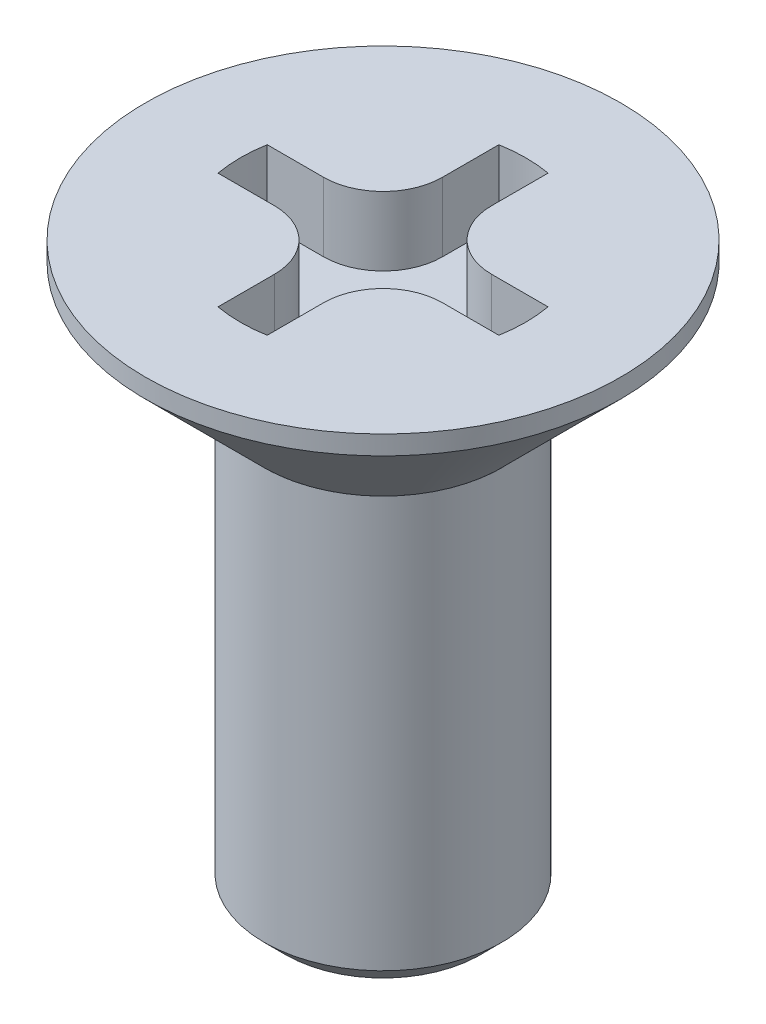
ISO-10303-21;
HEADER;
FILE_DESCRIPTION(('STEP AP214'),'2;1');
FILE_NAME('part.step','',(''),(''),'','','');
FILE_SCHEMA(('AUTOMOTIVE_DESIGN { 1 0 10303 214 1 1 1 1 }'));
ENDSEC;
DATA;
#1=APPLICATION_CONTEXT('core data for automotive mechanical design processes');
#2=APPLICATION_PROTOCOL_DEFINITION('international standard','automotive_design',2000,#1);
#3=PRODUCT_CONTEXT('',#1,'mechanical');
#4=PRODUCT('Part','Part','',(#3));
#5=PRODUCT_RELATED_PRODUCT_CATEGORY('part','',(#4));
#6=PRODUCT_DEFINITION_FORMATION('','',#4);
#7=PRODUCT_DEFINITION_CONTEXT('part definition',#1,'design');
#8=PRODUCT_DEFINITION('design','',#6,#7);
#9=PRODUCT_DEFINITION_SHAPE('','',#8);
#10=(LENGTH_UNIT() NAMED_UNIT(*) SI_UNIT(.MILLI.,.METRE.));
#11=(NAMED_UNIT(*) PLANE_ANGLE_UNIT() SI_UNIT($,.RADIAN.));
#12=(NAMED_UNIT(*) SI_UNIT($,.STERADIAN.) SOLID_ANGLE_UNIT());
#13=UNCERTAINTY_MEASURE_WITH_UNIT(LENGTH_MEASURE(1.E-05),#10,'distance_accuracy_value','');
#14=(GEOMETRIC_REPRESENTATION_CONTEXT(3) GLOBAL_UNCERTAINTY_ASSIGNED_CONTEXT((#13)) GLOBAL_UNIT_ASSIGNED_CONTEXT((#10,
#11,#12)) REPRESENTATION_CONTEXT('',''));
#15=CARTESIAN_POINT('',(0.,0.,0.));
#16=DIRECTION('',(0.,0.,1.));
#17=DIRECTION('',(1.,0.,0.));
#18=AXIS2_PLACEMENT_3D('',#15,#16,#17);
#19=CARTESIAN_POINT('',(0.,-4.55,0.));
#20=DIRECTION('',(0.,1.,0.));
#21=DIRECTION('',(0.,0.,1.));
#22=AXIS2_PLACEMENT_3D('',#19,#20,#21);
#23=CYLINDRICAL_SURFACE('',#22,1.025);
#24=CARTESIAN_POINT('',(0.,0.,0.));
#25=DIRECTION('',(0.,1.,0.));
#26=DIRECTION('',(0.,0.,1.));
#27=AXIS2_PLACEMENT_3D('',#24,#25,#26);
#28=CIRCLE('',#27,1.025);
#29=CARTESIAN_POINT('',(0.,0.,1.025));
#30=VERTEX_POINT('',#29);
#31=EDGE_CURVE('P0_E20',#30,#30,#28,.F.);
#32=ORIENTED_EDGE('',*,*,#31,.T.);
#33=EDGE_LOOP('',(#32));
#34=FACE_BOUND('',#33,.T.);
#35=CARTESIAN_POINT('',(0.,-4.55,0.));
#36=DIRECTION('',(0.,1.,0.));
#37=DIRECTION('',(0.,0.,1.));
#38=AXIS2_PLACEMENT_3D('',#35,#36,#37);
#39=CIRCLE('',#38,1.025);
#40=CARTESIAN_POINT('',(0.,-4.55,1.025));
#41=VERTEX_POINT('',#40);
#42=EDGE_CURVE('P0_E11',#41,#41,#39,.T.);
#43=ORIENTED_EDGE('',*,*,#42,.T.);
#44=EDGE_LOOP('',(#43));
#45=FACE_BOUND('',#44,.T.);
#46=ADVANCED_FACE('P0_F16',(#34,#45),#23,.T.);
#47=CARTESIAN_POINT('',(0.,0.,0.));
#48=DIRECTION('',(0.,1.,0.));
#49=DIRECTION('',(0.,0.,1.));
#50=AXIS2_PLACEMENT_3D('',#47,#48,#49);
#51=PLANE('',#50);
#52=ORIENTED_EDGE('',*,*,#31,.F.);
#53=EDGE_LOOP('',(#52));
#54=FACE_BOUND('',#53,.T.);
#55=CARTESIAN_POINT('',(-1.25,0.,0.));
#56=CARTESIAN_POINT('',(-1.25,0.,0.238161647635405));
#57=CARTESIAN_POINT('',(-1.16223537632804,0.,0.460118386952341));
#58=CARTESIAN_POINT('',(-1.0672352810342,0.,0.70037363449981));
#59=CARTESIAN_POINT('',(-0.883883476483185,0.,0.883883476483184));
#60=CARTESIAN_POINT('',(-0.701276541147978,0.,1.06664780722151));
#61=CARTESIAN_POINT('',(-0.460118386952341,0.,1.16223537632804));
#62=CARTESIAN_POINT('',(-0.238952578700221,0.,1.24989860318766));
#63=CARTESIAN_POINT('',(0.,0.,1.25));
#64=CARTESIAN_POINT('',(0.237906337866149,0.,1.25010095285193));
#65=CARTESIAN_POINT('',(0.460118386952341,0.,1.16223537632804));
#66=CARTESIAN_POINT('',(0.700373634500057,0.,1.06723528103401));
#67=CARTESIAN_POINT('',(0.883883476483184,0.,0.883883476483184));
#68=CARTESIAN_POINT('',(1.06664780722158,0.,0.701276541147861));
#69=CARTESIAN_POINT('',(1.16223537632804,0.,0.460118386952341));
#70=CARTESIAN_POINT('',(1.25,0.,0.23869676438945));
#71=CARTESIAN_POINT('',(1.25,0.,0.));
#72=B_SPLINE_CURVE_WITH_KNOTS('',2,(#55,#56,#57,#58,#59,#60,#61,#62,#63,#64,#65,#66,#67,#68,#69,
#70,#71),.UNSPECIFIED.,.F.,.F.,(3,2,2,2,2,2,2,2,3),(0.,0.125,0.25,0.375,0.5,0.625,0.75,0.875,
1.),.UNSPECIFIED.);
#73=CARTESIAN_POINT('',(-1.25,0.,0.));
#74=VERTEX_POINT('',#73);
#75=CARTESIAN_POINT('',(1.25,0.,0.));
#76=VERTEX_POINT('',#75);
#77=EDGE_CURVE('P0_E28',#74,#76,#72,.T.);
#78=ORIENTED_EDGE('',*,*,#77,.F.);
#79=CARTESIAN_POINT('',(1.25,0.,0.));
#80=CARTESIAN_POINT('',(1.25,0.,-0.238161647635405));
#81=CARTESIAN_POINT('',(1.16223537632804,0.,-0.460118386952341));
#82=CARTESIAN_POINT('',(1.0672352810342,0.,-0.70037363449981));
#83=CARTESIAN_POINT('',(0.883883476483185,0.,-0.883883476483184));
#84=CARTESIAN_POINT('',(0.701276541147978,0.,-1.06664780722151));
#85=CARTESIAN_POINT('',(0.460118386952341,0.,-1.16223537632804));
#86=CARTESIAN_POINT('',(0.238952578700221,0.,-1.24989860318766));
#87=CARTESIAN_POINT('',(0.,0.,-1.25));
#88=CARTESIAN_POINT('',(-0.237906337866149,0.,-1.25010095285193));
#89=CARTESIAN_POINT('',(-0.460118386952341,0.,-1.16223537632804));
#90=CARTESIAN_POINT('',(-0.700373634500057,0.,-1.06723528103401));
#91=CARTESIAN_POINT('',(-0.883883476483184,0.,-0.883883476483184));
#92=CARTESIAN_POINT('',(-1.06664780722158,0.,-0.701276541147861));
#93=CARTESIAN_POINT('',(-1.16223537632804,0.,-0.460118386952341));
#94=CARTESIAN_POINT('',(-1.25,0.,-0.23869676438945));
#95=CARTESIAN_POINT('',(-1.25,0.,0.));
#96=B_SPLINE_CURVE_WITH_KNOTS('',2,(#79,#80,#81,#82,#83,#84,#85,#86,#87,#88,#89,#90,#91,#92,#93,
#94,#95),.UNSPECIFIED.,.F.,.F.,(3,2,2,2,2,2,2,2,3),(0.,0.125,0.25,0.375,0.5,0.625,0.75,0.875,
1.),.UNSPECIFIED.);
#97=EDGE_CURVE('P0_E32',#76,#74,#96,.T.);
#98=ORIENTED_EDGE('',*,*,#97,.F.);
#99=EDGE_LOOP('',(#78,#98));
#100=FACE_BOUND('',#99,.T.);
#101=ADVANCED_FACE('P0_F17',(#54,#100),#51,.F.);
#102=OPEN_SHELL('',(#46,#101));
#103=SHELL_BASED_SURFACE_MODEL('P0_B1',(#102));
#104=CARTESIAN_POINT('',(0.,0.725,0.));
#105=DIRECTION('',(0.,-1.,0.));
#106=DIRECTION('',(0.,0.,-1.));
#107=AXIS2_PLACEMENT_3D('',#104,#105,#106);
#108=PLANE('',#107);
#109=DIRECTION('',(0.,0.,1.));
#110=VECTOR('',#109,1.);
#111=CARTESIAN_POINT('',(-0.2588834764832,0.725,1.477490895269));
#112=LINE('',#111,#110);
#113=CARTESIAN_POINT('',(-0.2588834764832,0.725,0.8838834764832));
#114=VERTEX_POINT('',#113);
#115=CARTESIAN_POINT('',(-0.258883476483234,0.725,1.47749089526939));
#116=VERTEX_POINT('',#115);
#117=EDGE_CURVE('P1_E151',#114,#116,#112,.T.);
#118=ORIENTED_EDGE('',*,*,#117,.T.);
#119=CARTESIAN_POINT('',(0.,0.725,0.));
#120=DIRECTION('',(0.,-1.,0.));
#121=DIRECTION('',(0.,0.,-1.));
#122=AXIS2_PLACEMENT_3D('',#119,#120,#121);
#123=CIRCLE('',#122,1.5);
#124=CARTESIAN_POINT('',(0.2588834764832,0.725,1.4774908952692));
#125=VERTEX_POINT('',#124);
#126=EDGE_CURVE('P1_E159',#116,#125,#123,.F.);
#127=ORIENTED_EDGE('',*,*,#126,.T.);
#128=DIRECTION('',(0.,0.,-1.));
#129=VECTOR('',#128,1.);
#130=CARTESIAN_POINT('',(0.2588834764832,0.725,0.8838834764832));
#131=LINE('',#130,#129);
#132=CARTESIAN_POINT('',(0.2588834764832,0.725,0.8838834764832));
#133=VERTEX_POINT('',#132);
#134=EDGE_CURVE('P1_E163',#125,#133,#131,.T.);
#135=ORIENTED_EDGE('',*,*,#134,.T.);
#136=CARTESIAN_POINT('',(0.8838834764832,0.725,0.8838834764832));
#137=DIRECTION('',(0.,-1.,0.));
#138=DIRECTION('',(0.,0.,-1.));
#139=AXIS2_PLACEMENT_3D('',#136,#137,#138);
#140=CIRCLE('',#139,0.625);
#141=CARTESIAN_POINT('',(0.8838834764832,0.725,0.2588834764832));
#142=VERTEX_POINT('',#141);
#143=EDGE_CURVE('P1_E215',#142,#133,#140,.F.);
#144=ORIENTED_EDGE('',*,*,#143,.F.);
#145=DIRECTION('',(1.,0.,0.));
#146=VECTOR('',#145,1.);
#147=CARTESIAN_POINT('',(1.477490895269,0.725,0.2588834764832));
#148=LINE('',#147,#146);
#149=CARTESIAN_POINT('',(1.47749089526939,0.725,0.258883476483234));
#150=VERTEX_POINT('',#149);
#151=EDGE_CURVE('P1_E234',#142,#150,#148,.T.);
#152=ORIENTED_EDGE('',*,*,#151,.T.);
#153=CARTESIAN_POINT('',(0.,0.725,0.));
#154=DIRECTION('',(0.,-1.,0.));
#155=DIRECTION('',(0.,0.,-1.));
#156=AXIS2_PLACEMENT_3D('',#153,#154,#155);
#157=CIRCLE('',#156,1.5);
#158=CARTESIAN_POINT('',(1.4774908952692,0.725,-0.2588834764832));
#159=VERTEX_POINT('',#158);
#160=EDGE_CURVE('P1_E211',#150,#159,#157,.F.);
#161=ORIENTED_EDGE('',*,*,#160,.T.);
#162=DIRECTION('',(-1.,0.,0.));
#163=VECTOR('',#162,1.);
#164=CARTESIAN_POINT('',(0.8838834764832,0.725,-0.2588834764832));
#165=LINE('',#164,#163);
#166=CARTESIAN_POINT('',(0.8838834764832,0.725,-0.2588834764832));
#167=VERTEX_POINT('',#166);
#168=EDGE_CURVE('P1_E210',#159,#167,#165,.T.);
#169=ORIENTED_EDGE('',*,*,#168,.T.);
#170=CARTESIAN_POINT('',(0.8838834764832,0.725,-0.8838834764832));
#171=DIRECTION('',(0.,-1.,0.));
#172=DIRECTION('',(0.,0.,-1.));
#173=AXIS2_PLACEMENT_3D('',#170,#171,#172);
#174=CIRCLE('',#173,0.625);
#175=CARTESIAN_POINT('',(0.2588834764832,0.725,-0.8838834764832));
#176=VERTEX_POINT('',#175);
#177=EDGE_CURVE('P1_E206',#176,#167,#174,.F.);
#178=ORIENTED_EDGE('',*,*,#177,.F.);
#179=DIRECTION('',(0.,0.,-1.));
#180=VECTOR('',#179,1.);
#181=CARTESIAN_POINT('',(0.2588834764832,0.725,-1.477490895269));
#182=LINE('',#181,#180);
#183=CARTESIAN_POINT('',(0.258883476483234,0.725,-1.47749089526939));
#184=VERTEX_POINT('',#183);
#185=EDGE_CURVE('P1_E231',#176,#184,#182,.T.);
#186=ORIENTED_EDGE('',*,*,#185,.T.);
#187=CARTESIAN_POINT('',(0.,0.725,0.));
#188=DIRECTION('',(0.,-1.,0.));
#189=DIRECTION('',(0.,0.,-1.));
#190=AXIS2_PLACEMENT_3D('',#187,#188,#189);
#191=CIRCLE('',#190,1.5);
#192=CARTESIAN_POINT('',(-0.2588834764832,0.725,-1.4774908952692));
#193=VERTEX_POINT('',#192);
#194=EDGE_CURVE('P1_E202',#184,#193,#191,.F.);
#195=ORIENTED_EDGE('',*,*,#194,.T.);
#196=DIRECTION('',(0.,0.,1.));
#197=VECTOR('',#196,1.);
#198=CARTESIAN_POINT('',(-0.2588834764832,0.725,-0.8838834764832));
#199=LINE('',#198,#197);
#200=CARTESIAN_POINT('',(-0.2588834764832,0.725,-0.8838834764832));
#201=VERTEX_POINT('',#200);
#202=EDGE_CURVE('P1_E201',#193,#201,#199,.T.);
#203=ORIENTED_EDGE('',*,*,#202,.T.);
#204=CARTESIAN_POINT('',(-0.8838834764832,0.725,-0.8838834764832));
#205=DIRECTION('',(0.,-1.,0.));
#206=DIRECTION('',(0.,0.,-1.));
#207=AXIS2_PLACEMENT_3D('',#204,#205,#206);
#208=CIRCLE('',#207,0.625);
#209=CARTESIAN_POINT('',(-0.8838834764832,0.725,-0.2588834764832));
#210=VERTEX_POINT('',#209);
#211=EDGE_CURVE('P1_E197',#210,#201,#208,.F.);
#212=ORIENTED_EDGE('',*,*,#211,.F.);
#213=DIRECTION('',(-1.,0.,0.));
#214=VECTOR('',#213,1.);
#215=CARTESIAN_POINT('',(-1.477490895269,0.725,-0.2588834764832));
#216=LINE('',#215,#214);
#217=CARTESIAN_POINT('',(-1.47749089526939,0.725,-0.258883476483234));
#218=VERTEX_POINT('',#217);
#219=EDGE_CURVE('P1_E227',#210,#218,#216,.T.);
#220=ORIENTED_EDGE('',*,*,#219,.T.);
#221=CARTESIAN_POINT('',(0.,0.725,0.));
#222=DIRECTION('',(0.,-1.,0.));
#223=DIRECTION('',(0.,0.,-1.));
#224=AXIS2_PLACEMENT_3D('',#221,#222,#223);
#225=CIRCLE('',#224,1.5);
#226=CARTESIAN_POINT('',(-1.47749089526939,0.725,0.258883476483234));
#227=VERTEX_POINT('',#226);
#228=EDGE_CURVE('P1_E132',#218,#227,#225,.F.);
#229=ORIENTED_EDGE('',*,*,#228,.T.);
#230=DIRECTION('',(1.,0.,0.));
#231=VECTOR('',#230,1.);
#232=CARTESIAN_POINT('',(-0.8838834764832,0.725,0.2588834764832));
#233=LINE('',#232,#231);
#234=CARTESIAN_POINT('',(-0.8838834764832,0.725,0.2588834764832));
#235=VERTEX_POINT('',#234);
#236=EDGE_CURVE('P1_E129',#227,#235,#233,.T.);
#237=ORIENTED_EDGE('',*,*,#236,.T.);
#238=CARTESIAN_POINT('',(-0.8838834764832,0.725,0.8838834764832));
#239=DIRECTION('',(0.,-1.,0.));
#240=DIRECTION('',(0.,0.,-1.));
#241=AXIS2_PLACEMENT_3D('',#238,#239,#240);
#242=CIRCLE('',#241,0.625);
#243=EDGE_CURVE('P1_E19',#114,#235,#242,.F.);
#244=ORIENTED_EDGE('',*,*,#243,.F.);
#245=EDGE_LOOP('',(#118,#127,#135,#144,#152,#161,#169,#178,#186,#195,#203,#212,#220,#229,#237,#244));
#246=FACE_BOUND('',#245,.T.);
#247=ADVANCED_FACE('P1_F16',(#246),#108,.F.);
#248=CARTESIAN_POINT('',(-0.8838834764832,0.725,0.2588834764832));
#249=DIRECTION('',(0.,0.,1.));
#250=DIRECTION('',(1.,0.,0.));
#251=AXIS2_PLACEMENT_3D('',#248,#249,#250);
#252=PLANE('',#251);
#253=ORIENTED_EDGE('',*,*,#236,.F.);
#254=DIRECTION('',(0.,-1.,0.));
#255=VECTOR('',#254,1.);
#256=CARTESIAN_POINT('',(-1.47749089526939,0.725,0.258883476483268));
#257=LINE('',#256,#255);
#258=CARTESIAN_POINT('',(-1.47749089526939,1.45,0.258883476483234));
#259=VERTEX_POINT('',#258);
#260=EDGE_CURVE('P1_E195',#227,#259,#257,.F.);
#261=ORIENTED_EDGE('',*,*,#260,.T.);
#262=DIRECTION('',(1.,0.,0.));
#263=VECTOR('',#262,1.);
#264=CARTESIAN_POINT('',(0.,1.45,0.2588834764832));
#265=LINE('',#264,#263);
#266=CARTESIAN_POINT('',(-0.8838834764832,1.45,0.2588834764832));
#267=VERTEX_POINT('',#266);
#268=EDGE_CURVE('P1_E140',#259,#267,#265,.T.);
#269=ORIENTED_EDGE('',*,*,#268,.T.);
#270=DIRECTION('',(0.,-1.,0.));
#271=VECTOR('',#270,1.);
#272=CARTESIAN_POINT('',(-0.8838834764832,0.725,0.2588834764832));
#273=LINE('',#272,#271);
#274=EDGE_CURVE('P1_E137',#235,#267,#273,.F.);
#275=ORIENTED_EDGE('',*,*,#274,.F.);
#276=EDGE_LOOP('',(#253,#261,#269,#275));
#277=FACE_BOUND('',#276,.T.);
#278=ADVANCED_FACE('P1_F138',(#277),#252,.F.);
#279=CARTESIAN_POINT('',(-0.8838834764832,0.725,0.8838834764832));
#280=DIRECTION('',(0.,-1.,0.));
#281=DIRECTION('',(0.,0.,-1.));
#282=AXIS2_PLACEMENT_3D('',#279,#280,#281);
#283=CYLINDRICAL_SURFACE('',#282,0.625);
#284=ORIENTED_EDGE('',*,*,#274,.T.);
#285=CARTESIAN_POINT('',(-0.8838834764832,1.45,0.8838834764832));
#286=DIRECTION('',(0.,-1.,0.));
#287=DIRECTION('',(0.,0.,-1.));
#288=AXIS2_PLACEMENT_3D('',#285,#286,#287);
#289=CIRCLE('',#288,0.625);
#290=CARTESIAN_POINT('',(-0.2588834764832,1.45,0.8838834764832));
#291=VERTEX_POINT('',#290);
#292=EDGE_CURVE('P1_E148',#267,#291,#289,.T.);
#293=ORIENTED_EDGE('',*,*,#292,.T.);
#294=DIRECTION('',(0.,1.,0.));
#295=VECTOR('',#294,1.);
#296=CARTESIAN_POINT('',(-0.2588834764832,0.725,0.8838834764832));
#297=LINE('',#296,#295);
#298=EDGE_CURVE('P1_E143',#291,#114,#297,.F.);
#299=ORIENTED_EDGE('',*,*,#298,.T.);
#300=ORIENTED_EDGE('',*,*,#243,.T.);
#301=EDGE_LOOP('',(#284,#293,#299,#300));
#302=FACE_BOUND('',#301,.T.);
#303=ADVANCED_FACE('P1_F145',(#302),#283,.T.);
#304=CARTESIAN_POINT('',(-0.2588834764832,0.725,1.477490895269));
#305=DIRECTION('',(-1.,0.,0.));
#306=DIRECTION('',(0.,0.,1.));
#307=AXIS2_PLACEMENT_3D('',#304,#305,#306);
#308=PLANE('',#307);
#309=ORIENTED_EDGE('',*,*,#117,.F.);
#310=ORIENTED_EDGE('',*,*,#298,.F.);
#311=DIRECTION('',(0.,0.,-1.));
#312=VECTOR('',#311,1.);
#313=CARTESIAN_POINT('',(-0.2588834764832,1.45,0.));
#314=LINE('',#313,#312);
#315=CARTESIAN_POINT('',(-0.258883476483234,1.45,1.47749089526939));
#316=VERTEX_POINT('',#315);
#317=EDGE_CURVE('P1_E192',#291,#316,#314,.F.);
#318=ORIENTED_EDGE('',*,*,#317,.T.);
#319=DIRECTION('',(0.,-1.,0.));
#320=VECTOR('',#319,1.);
#321=CARTESIAN_POINT('',(-0.258883476483268,0.725,1.47749089526939));
#322=LINE('',#321,#320);
#323=EDGE_CURVE('P1_E156',#316,#116,#322,.T.);
#324=ORIENTED_EDGE('',*,*,#323,.T.);
#325=EDGE_LOOP('',(#309,#310,#318,#324));
#326=FACE_BOUND('',#325,.T.);
#327=ADVANCED_FACE('P1_F154',(#326),#308,.F.);
#328=CARTESIAN_POINT('',(0.,0.725,0.));
#329=DIRECTION('',(0.,-1.,0.));
#330=DIRECTION('',(0.,0.,-1.));
#331=AXIS2_PLACEMENT_3D('',#328,#329,#330);
#332=CYLINDRICAL_SURFACE('',#331,1.5);
#333=ORIENTED_EDGE('',*,*,#126,.F.);
#334=ORIENTED_EDGE('',*,*,#323,.F.);
#335=CARTESIAN_POINT('',(0.,1.45,0.));
#336=DIRECTION('',(0.,-1.,0.));
#337=DIRECTION('',(0.,0.,-1.));
#338=AXIS2_PLACEMENT_3D('',#335,#336,#337);
#339=CIRCLE('',#338,1.5);
#340=CARTESIAN_POINT('',(0.2588834764832,1.45,1.4774908952692));
#341=VERTEX_POINT('',#340);
#342=EDGE_CURVE('P1_E190',#316,#341,#339,.F.);
#343=ORIENTED_EDGE('',*,*,#342,.T.);
#344=DIRECTION('',(0.,1.,0.));
#345=VECTOR('',#344,1.);
#346=CARTESIAN_POINT('',(0.2588834764832,0.725,1.477490895269));
#347=LINE('',#346,#345);
#348=EDGE_CURVE('P1_E218',#341,#125,#347,.F.);
#349=ORIENTED_EDGE('',*,*,#348,.T.);
#350=EDGE_LOOP('',(#333,#334,#343,#349));
#351=FACE_BOUND('',#350,.T.);
#352=ADVANCED_FACE('P1_F452',(#351),#332,.F.);
#353=CARTESIAN_POINT('',(0.2588834764832,0.725,0.8838834764832));
#354=DIRECTION('',(1.,0.,0.));
#355=DIRECTION('',(0.,0.,-1.));
#356=AXIS2_PLACEMENT_3D('',#353,#354,#355);
#357=PLANE('',#356);
#358=ORIENTED_EDGE('',*,*,#134,.F.);
#359=ORIENTED_EDGE('',*,*,#348,.F.);
#360=DIRECTION('',(0.,0.,-1.));
#361=VECTOR('',#360,1.);
#362=CARTESIAN_POINT('',(0.2588834764832,1.45,0.));
#363=LINE('',#362,#361);
#364=CARTESIAN_POINT('',(0.2588834764832,1.45,0.8838834764832));
#365=VERTEX_POINT('',#364);
#366=EDGE_CURVE('P1_E189',#341,#365,#363,.T.);
#367=ORIENTED_EDGE('',*,*,#366,.T.);
#368=DIRECTION('',(0.,-1.,0.));
#369=VECTOR('',#368,1.);
#370=CARTESIAN_POINT('',(0.2588834764832,0.725,0.8838834764832));
#371=LINE('',#370,#369);
#372=EDGE_CURVE('P1_E217',#133,#365,#371,.F.);
#373=ORIENTED_EDGE('',*,*,#372,.F.);
#374=EDGE_LOOP('',(#358,#359,#367,#373));
#375=FACE_BOUND('',#374,.T.);
#376=ADVANCED_FACE('P1_F444',(#375),#357,.F.);
#377=CARTESIAN_POINT('',(0.8838834764832,0.725,0.8838834764832));
#378=DIRECTION('',(0.,-1.,0.));
#379=DIRECTION('',(0.,0.,-1.));
#380=AXIS2_PLACEMENT_3D('',#377,#378,#379);
#381=CYLINDRICAL_SURFACE('',#380,0.625);
#382=ORIENTED_EDGE('',*,*,#372,.T.);
#383=CARTESIAN_POINT('',(0.8838834764832,1.45,0.8838834764832));
#384=DIRECTION('',(0.,-1.,0.));
#385=DIRECTION('',(0.,0.,-1.));
#386=AXIS2_PLACEMENT_3D('',#383,#384,#385);
#387=CIRCLE('',#386,0.625);
#388=CARTESIAN_POINT('',(0.8838834764832,1.45,0.2588834764832));
#389=VERTEX_POINT('',#388);
#390=EDGE_CURVE('P1_E187',#365,#389,#387,.T.);
#391=ORIENTED_EDGE('',*,*,#390,.T.);
#392=DIRECTION('',(0.,1.,0.));
#393=VECTOR('',#392,1.);
#394=CARTESIAN_POINT('',(0.8838834764832,0.725,0.2588834764832));
#395=LINE('',#394,#393);
#396=EDGE_CURVE('P1_E235',#389,#142,#395,.F.);
#397=ORIENTED_EDGE('',*,*,#396,.T.);
#398=ORIENTED_EDGE('',*,*,#143,.T.);
#399=EDGE_LOOP('',(#382,#391,#397,#398));
#400=FACE_BOUND('',#399,.T.);
#401=ADVANCED_FACE('P1_F435',(#400),#381,.T.);
#402=CARTESIAN_POINT('',(1.477490895269,0.725,0.2588834764832));
#403=DIRECTION('',(0.,0.,1.));
#404=DIRECTION('',(1.,0.,0.));
#405=AXIS2_PLACEMENT_3D('',#402,#403,#404);
#406=PLANE('',#405);
#407=ORIENTED_EDGE('',*,*,#151,.F.);
#408=ORIENTED_EDGE('',*,*,#396,.F.);
#409=DIRECTION('',(1.,0.,0.));
#410=VECTOR('',#409,1.);
#411=CARTESIAN_POINT('',(0.,1.45,0.2588834764832));
#412=LINE('',#411,#410);
#413=CARTESIAN_POINT('',(1.47749089526939,1.45,0.258883476483234));
#414=VERTEX_POINT('',#413);
#415=EDGE_CURVE('P1_E186',#389,#414,#412,.T.);
#416=ORIENTED_EDGE('',*,*,#415,.T.);
#417=DIRECTION('',(0.,-1.,0.));
#418=VECTOR('',#417,1.);
#419=CARTESIAN_POINT('',(1.47749089526939,0.725,0.258883476483268));
#420=LINE('',#419,#418);
#421=EDGE_CURVE('P1_E214',#414,#150,#420,.T.);
#422=ORIENTED_EDGE('',*,*,#421,.T.);
#423=EDGE_LOOP('',(#407,#408,#416,#422));
#424=FACE_BOUND('',#423,.T.);
#425=ADVANCED_FACE('P1_F426',(#424),#406,.F.);
#426=CARTESIAN_POINT('',(0.,0.725,0.));
#427=DIRECTION('',(0.,-1.,0.));
#428=DIRECTION('',(0.,0.,-1.));
#429=AXIS2_PLACEMENT_3D('',#426,#427,#428);
#430=CYLINDRICAL_SURFACE('',#429,1.5);
#431=ORIENTED_EDGE('',*,*,#160,.F.);
#432=ORIENTED_EDGE('',*,*,#421,.F.);
#433=CARTESIAN_POINT('',(0.,1.45,0.));
#434=DIRECTION('',(0.,-1.,0.));
#435=DIRECTION('',(0.,0.,-1.));
#436=AXIS2_PLACEMENT_3D('',#433,#434,#435);
#437=CIRCLE('',#436,1.5);
#438=CARTESIAN_POINT('',(1.4774908952692,1.45,-0.2588834764832));
#439=VERTEX_POINT('',#438);
#440=EDGE_CURVE('P1_E184',#414,#439,#437,.F.);
#441=ORIENTED_EDGE('',*,*,#440,.T.);
#442=DIRECTION('',(0.,1.,0.));
#443=VECTOR('',#442,1.);
#444=CARTESIAN_POINT('',(1.477490895269,0.725,-0.2588834764832));
#445=LINE('',#444,#443);
#446=EDGE_CURVE('P1_E213',#439,#159,#445,.F.);
#447=ORIENTED_EDGE('',*,*,#446,.T.);
#448=EDGE_LOOP('',(#431,#432,#441,#447));
#449=FACE_BOUND('',#448,.T.);
#450=ADVANCED_FACE('P1_F417',(#449),#430,.F.);
#451=CARTESIAN_POINT('',(0.8838834764832,0.725,-0.2588834764832));
#452=DIRECTION('',(0.,0.,-1.));
#453=DIRECTION('',(-1.,0.,0.));
#454=AXIS2_PLACEMENT_3D('',#451,#452,#453);
#455=PLANE('',#454);
#456=ORIENTED_EDGE('',*,*,#446,.F.);
#457=DIRECTION('',(1.,0.,0.));
#458=VECTOR('',#457,1.);
#459=CARTESIAN_POINT('',(0.,1.45,-0.2588834764832));
#460=LINE('',#459,#458);
#461=CARTESIAN_POINT('',(0.8838834764832,1.45,-0.2588834764832));
#462=VERTEX_POINT('',#461);
#463=EDGE_CURVE('P1_E183',#439,#462,#460,.F.);
#464=ORIENTED_EDGE('',*,*,#463,.T.);
#465=DIRECTION('',(0.,-1.,0.));
#466=VECTOR('',#465,1.);
#467=CARTESIAN_POINT('',(0.8838834764832,0.725,-0.2588834764832));
#468=LINE('',#467,#466);
#469=EDGE_CURVE('P1_E209',#167,#462,#468,.F.);
#470=ORIENTED_EDGE('',*,*,#469,.F.);
#471=ORIENTED_EDGE('',*,*,#168,.F.);
#472=EDGE_LOOP('',(#456,#464,#470,#471));
#473=FACE_BOUND('',#472,.T.);
#474=ADVANCED_FACE('P1_F408',(#473),#455,.F.);
#475=CARTESIAN_POINT('',(0.8838834764832,0.725,-0.8838834764832));
#476=DIRECTION('',(0.,-1.,0.));
#477=DIRECTION('',(0.,0.,-1.));
#478=AXIS2_PLACEMENT_3D('',#475,#476,#477);
#479=CYLINDRICAL_SURFACE('',#478,0.625);
#480=CARTESIAN_POINT('',(0.8838834764832,1.45,-0.8838834764832));
#481=DIRECTION('',(0.,-1.,0.));
#482=DIRECTION('',(0.,0.,-1.));
#483=AXIS2_PLACEMENT_3D('',#480,#481,#482);
#484=CIRCLE('',#483,0.625);
#485=CARTESIAN_POINT('',(0.2588834764832,1.45,-0.8838834764832));
#486=VERTEX_POINT('',#485);
#487=EDGE_CURVE('P1_E181',#462,#486,#484,.T.);
#488=ORIENTED_EDGE('',*,*,#487,.T.);
#489=DIRECTION('',(0.,1.,0.));
#490=VECTOR('',#489,1.);
#491=CARTESIAN_POINT('',(0.2588834764832,0.725,-0.8838834764832));
#492=LINE('',#491,#490);
#493=EDGE_CURVE('P1_E233',#486,#176,#492,.F.);
#494=ORIENTED_EDGE('',*,*,#493,.T.);
#495=ORIENTED_EDGE('',*,*,#177,.T.);
#496=ORIENTED_EDGE('',*,*,#469,.T.);
#497=EDGE_LOOP('',(#488,#494,#495,#496));
#498=FACE_BOUND('',#497,.T.);
#499=ADVANCED_FACE('P1_F399',(#498),#479,.T.);
#500=CARTESIAN_POINT('',(0.2588834764832,0.725,-1.477490895269));
#501=DIRECTION('',(1.,0.,0.));
#502=DIRECTION('',(0.,0.,-1.));
#503=AXIS2_PLACEMENT_3D('',#500,#501,#502);
#504=PLANE('',#503);
#505=ORIENTED_EDGE('',*,*,#493,.F.);
#506=DIRECTION('',(0.,0.,-1.));
#507=VECTOR('',#506,1.);
#508=CARTESIAN_POINT('',(0.2588834764832,1.45,0.));
#509=LINE('',#508,#507);
#510=CARTESIAN_POINT('',(0.258883476483234,1.45,-1.47749089526939));
#511=VERTEX_POINT('',#510);
#512=EDGE_CURVE('P1_E180',#486,#511,#509,.T.);
#513=ORIENTED_EDGE('',*,*,#512,.T.);
#514=DIRECTION('',(0.,-1.,0.));
#515=VECTOR('',#514,1.);
#516=CARTESIAN_POINT('',(0.258883476483268,0.725,-1.47749089526939));
#517=LINE('',#516,#515);
#518=EDGE_CURVE('P1_E205',#511,#184,#517,.T.);
#519=ORIENTED_EDGE('',*,*,#518,.T.);
#520=ORIENTED_EDGE('',*,*,#185,.F.);
#521=EDGE_LOOP('',(#505,#513,#519,#520));
#522=FACE_BOUND('',#521,.T.);
#523=ADVANCED_FACE('P1_F390',(#522),#504,.F.);
#524=CARTESIAN_POINT('',(0.,0.725,0.));
#525=DIRECTION('',(0.,-1.,0.));
#526=DIRECTION('',(0.,0.,-1.));
#527=AXIS2_PLACEMENT_3D('',#524,#525,#526);
#528=CYLINDRICAL_SURFACE('',#527,1.5);
#529=ORIENTED_EDGE('',*,*,#518,.F.);
#530=CARTESIAN_POINT('',(0.,1.45,0.));
#531=DIRECTION('',(0.,-1.,0.));
#532=DIRECTION('',(0.,0.,-1.));
#533=AXIS2_PLACEMENT_3D('',#530,#531,#532);
#534=CIRCLE('',#533,1.5);
#535=CARTESIAN_POINT('',(-0.2588834764832,1.45,-1.4774908952692));
#536=VERTEX_POINT('',#535);
#537=EDGE_CURVE('P1_E178',#511,#536,#534,.F.);
#538=ORIENTED_EDGE('',*,*,#537,.T.);
#539=DIRECTION('',(0.,1.,0.));
#540=VECTOR('',#539,1.);
#541=CARTESIAN_POINT('',(-0.2588834764832,0.725,-1.477490895269));
#542=LINE('',#541,#540);
#543=EDGE_CURVE('P1_E204',#536,#193,#542,.F.);
#544=ORIENTED_EDGE('',*,*,#543,.T.);
#545=ORIENTED_EDGE('',*,*,#194,.F.);
#546=EDGE_LOOP('',(#529,#538,#544,#545));
#547=FACE_BOUND('',#546,.T.);
#548=ADVANCED_FACE('P1_F381',(#547),#528,.F.);
#549=CARTESIAN_POINT('',(-0.2588834764832,0.725,-0.8838834764832));
#550=DIRECTION('',(-1.,0.,0.));
#551=DIRECTION('',(0.,0.,1.));
#552=AXIS2_PLACEMENT_3D('',#549,#550,#551);
#553=PLANE('',#552);
#554=ORIENTED_EDGE('',*,*,#543,.F.);
#555=DIRECTION('',(0.,0.,-1.));
#556=VECTOR('',#555,1.);
#557=CARTESIAN_POINT('',(-0.2588834764832,1.45,0.));
#558=LINE('',#557,#556);
#559=CARTESIAN_POINT('',(-0.2588834764832,1.45,-0.8838834764832));
#560=VERTEX_POINT('',#559);
#561=EDGE_CURVE('P1_E177',#536,#560,#558,.F.);
#562=ORIENTED_EDGE('',*,*,#561,.T.);
#563=DIRECTION('',(0.,-1.,0.));
#564=VECTOR('',#563,1.);
#565=CARTESIAN_POINT('',(-0.2588834764832,0.725,-0.8838834764832));
#566=LINE('',#565,#564);
#567=EDGE_CURVE('P1_E200',#201,#560,#566,.F.);
#568=ORIENTED_EDGE('',*,*,#567,.F.);
#569=ORIENTED_EDGE('',*,*,#202,.F.);
#570=EDGE_LOOP('',(#554,#562,#568,#569));
#571=FACE_BOUND('',#570,.T.);
#572=ADVANCED_FACE('P1_F372',(#571),#553,.F.);
#573=CARTESIAN_POINT('',(-0.8838834764832,0.725,-0.8838834764832));
#574=DIRECTION('',(0.,-1.,0.));
#575=DIRECTION('',(0.,0.,-1.));
#576=AXIS2_PLACEMENT_3D('',#573,#574,#575);
#577=CYLINDRICAL_SURFACE('',#576,0.625);
#578=CARTESIAN_POINT('',(-0.8838834764832,1.45,-0.8838834764832));
#579=DIRECTION('',(0.,-1.,0.));
#580=DIRECTION('',(0.,0.,-1.));
#581=AXIS2_PLACEMENT_3D('',#578,#579,#580);
#582=CIRCLE('',#581,0.625);
#583=CARTESIAN_POINT('',(-0.8838834764832,1.45,-0.2588834764832));
#584=VERTEX_POINT('',#583);
#585=EDGE_CURVE('P1_E175',#560,#584,#582,.T.);
#586=ORIENTED_EDGE('',*,*,#585,.T.);
#587=DIRECTION('',(0.,1.,0.));
#588=VECTOR('',#587,1.);
#589=CARTESIAN_POINT('',(-0.8838834764832,0.725,-0.2588834764832));
#590=LINE('',#589,#588);
#591=EDGE_CURVE('P1_E229',#584,#210,#590,.F.);
#592=ORIENTED_EDGE('',*,*,#591,.T.);
#593=ORIENTED_EDGE('',*,*,#211,.T.);
#594=ORIENTED_EDGE('',*,*,#567,.T.);
#595=EDGE_LOOP('',(#586,#592,#593,#594));
#596=FACE_BOUND('',#595,.T.);
#597=ADVANCED_FACE('P1_F364',(#596),#577,.T.);
#598=CARTESIAN_POINT('',(-1.477490895269,0.725,-0.2588834764832));
#599=DIRECTION('',(0.,0.,-1.));
#600=DIRECTION('',(-1.,0.,0.));
#601=AXIS2_PLACEMENT_3D('',#598,#599,#600);
#602=PLANE('',#601);
#603=ORIENTED_EDGE('',*,*,#591,.F.);
#604=DIRECTION('',(1.,0.,0.));
#605=VECTOR('',#604,1.);
#606=CARTESIAN_POINT('',(0.,1.45,-0.2588834764832));
#607=LINE('',#606,#605);
#608=CARTESIAN_POINT('',(-1.47749089526939,1.45,-0.258883476483234));
#609=VERTEX_POINT('',#608);
#610=EDGE_CURVE('P1_E34',#584,#609,#607,.F.);
#611=ORIENTED_EDGE('',*,*,#610,.T.);
#612=DIRECTION('',(0.,-1.,0.));
#613=VECTOR('',#612,1.);
#614=CARTESIAN_POINT('',(-1.47749089526939,0.725,-0.258883476483267));
#615=LINE('',#614,#613);
#616=EDGE_CURVE('P1_E196',#609,#218,#615,.T.);
#617=ORIENTED_EDGE('',*,*,#616,.T.);
#618=ORIENTED_EDGE('',*,*,#219,.F.);
#619=EDGE_LOOP('',(#603,#611,#617,#618));
#620=FACE_BOUND('',#619,.T.);
#621=ADVANCED_FACE('P1_F299',(#620),#602,.F.);
#622=CARTESIAN_POINT('',(0.,0.725,0.));
#623=DIRECTION('',(0.,-1.,0.));
#624=DIRECTION('',(0.,0.,-1.));
#625=AXIS2_PLACEMENT_3D('',#622,#623,#624);
#626=CYLINDRICAL_SURFACE('',#625,1.5);
#627=ORIENTED_EDGE('',*,*,#228,.F.);
#628=ORIENTED_EDGE('',*,*,#616,.F.);
#629=CARTESIAN_POINT('',(0.,1.45,0.));
#630=DIRECTION('',(0.,-1.,0.));
#631=DIRECTION('',(0.,0.,-1.));
#632=AXIS2_PLACEMENT_3D('',#629,#630,#631);
#633=CIRCLE('',#632,1.5);
#634=EDGE_CURVE('P1_E172',#609,#259,#633,.F.);
#635=ORIENTED_EDGE('',*,*,#634,.T.);
#636=ORIENTED_EDGE('',*,*,#260,.F.);
#637=EDGE_LOOP('',(#627,#628,#635,#636));
#638=FACE_BOUND('',#637,.T.);
#639=ADVANCED_FACE('P1_F292',(#638),#626,.F.);
#640=CARTESIAN_POINT('',(0.,1.45,0.));
#641=DIRECTION('',(0.,-1.,0.));
#642=DIRECTION('',(0.,0.,-1.));
#643=AXIS2_PLACEMENT_3D('',#640,#641,#642);
#644=PLANE('',#643);
#645=ORIENTED_EDGE('',*,*,#610,.F.);
#646=ORIENTED_EDGE('',*,*,#585,.F.);
#647=ORIENTED_EDGE('',*,*,#561,.F.);
#648=ORIENTED_EDGE('',*,*,#537,.F.);
#649=ORIENTED_EDGE('',*,*,#512,.F.);
#650=ORIENTED_EDGE('',*,*,#487,.F.);
#651=ORIENTED_EDGE('',*,*,#463,.F.);
#652=ORIENTED_EDGE('',*,*,#440,.F.);
#653=ORIENTED_EDGE('',*,*,#415,.F.);
#654=ORIENTED_EDGE('',*,*,#390,.F.);
#655=ORIENTED_EDGE('',*,*,#366,.F.);
#656=ORIENTED_EDGE('',*,*,#342,.F.);
#657=ORIENTED_EDGE('',*,*,#317,.F.);
#658=ORIENTED_EDGE('',*,*,#292,.F.);
#659=ORIENTED_EDGE('',*,*,#268,.F.);
#660=ORIENTED_EDGE('',*,*,#634,.F.);
#661=EDGE_LOOP('',(#645,#646,#647,#648,#649,#650,#651,#652,#653,#654,#655,#656,#657,#658,#659,#660));
#662=FACE_BOUND('',#661,.T.);
#663=CARTESIAN_POINT('',(0.,1.45,0.));
#664=DIRECTION('',(0.,-1.,0.));
#665=DIRECTION('',(0.,0.,-1.));
#666=AXIS2_PLACEMENT_3D('',#663,#664,#665);
#667=CIRCLE('',#666,2.5);
#668=CARTESIAN_POINT('',(0.,1.45,-2.5));
#669=VERTEX_POINT('',#668);
#670=EDGE_CURVE('P1_E169',#669,#669,#667,.T.);
#671=ORIENTED_EDGE('',*,*,#670,.F.);
#672=EDGE_LOOP('',(#671));
#673=FACE_BOUND('',#672,.T.);
#674=ADVANCED_FACE('P1_F287',(#662,#673),#644,.F.);
#675=CARTESIAN_POINT('',(0.,1.75,0.));
#676=DIRECTION('',(0.,-1.,0.));
#677=DIRECTION('',(0.,0.,-1.));
#678=AXIS2_PLACEMENT_3D('',#675,#676,#677);
#679=CYLINDRICAL_SURFACE('',#678,2.5);
#680=CARTESIAN_POINT('',(0.,1.24999999997044,0.));
#681=DIRECTION('',(0.,1.,0.));
#682=DIRECTION('',(1.,0.,0.));
#683=AXIS2_PLACEMENT_3D('',#680,#681,#682);
#684=CIRCLE('',#683,2.49999999994088);
#685=CARTESIAN_POINT('',(2.49999999994088,1.24999999997044,0.));
#686=VERTEX_POINT('',#685);
#687=EDGE_CURVE('P1_E168',#686,#686,#684,.F.);
#688=ORIENTED_EDGE('',*,*,#687,.F.);
#689=EDGE_LOOP('',(#688));
#690=FACE_BOUND('',#689,.T.);
#691=ORIENTED_EDGE('',*,*,#670,.T.);
#692=EDGE_LOOP('',(#691));
#693=FACE_BOUND('',#692,.T.);
#694=ADVANCED_FACE('P1_F284',(#690,#693),#679,.T.);
#695=CARTESIAN_POINT('',(0.,-4.55,0.));
#696=DIRECTION('',(0.,-1.,0.));
#697=DIRECTION('',(0.,0.,-1.));
#698=AXIS2_PLACEMENT_3D('',#695,#696,#697);
#699=PLANE('',#698);
#700=CARTESIAN_POINT('',(0.,-4.54999999999472,0.));
#701=DIRECTION('',(0.,1.,0.));
#702=DIRECTION('',(0.,0.,1.));
#703=AXIS2_PLACEMENT_3D('',#700,#701,#702);
#704=CIRCLE('',#703,1.02500000002692);
#705=CARTESIAN_POINT('',(0.,-4.54999999999472,1.02500000002692));
#706=VERTEX_POINT('',#705);
#707=EDGE_CURVE('P1_E165',#706,#706,#704,.T.);
#708=ORIENTED_EDGE('',*,*,#707,.F.);
#709=EDGE_LOOP('',(#708));
#710=FACE_BOUND('',#709,.T.);
#711=ADVANCED_FACE('P1_F280',(#710),#699,.T.);
#712=CARTESIAN_POINT('',(0.,1.2499999999136,0.));
#713=DIRECTION('',(0.,1.,0.));
#714=DIRECTION('',(0.,0.,1.));
#715=AXIS2_PLACEMENT_3D('',#712,#713,#714);
#716=CONICAL_SURFACE('',#715,2.49999999988404,0.785398163397448);
#717=CARTESIAN_POINT('',(0.,0.,0.));
#718=DIRECTION('',(0.,-1.,0.));
#719=DIRECTION('',(0.,0.,-1.));
#720=AXIS2_PLACEMENT_3D('',#717,#718,#719);
#721=CIRCLE('',#720,1.25);
#722=CARTESIAN_POINT('',(0.,0.,-1.25));
#723=VERTEX_POINT('',#722);
#724=EDGE_CURVE('P1_E25',#723,#723,#721,.T.);
#725=ORIENTED_EDGE('',*,*,#724,.F.);
#726=EDGE_LOOP('',(#725));
#727=FACE_BOUND('',#726,.T.);
#728=ORIENTED_EDGE('',*,*,#687,.T.);
#729=EDGE_LOOP('',(#728));
#730=FACE_BOUND('',#729,.T.);
#731=ADVANCED_FACE('P1_F276',(#727,#730),#716,.T.);
#732=CARTESIAN_POINT('',(0.,-4.32499999993752,0.));
#733=DIRECTION('',(0.,1.,0.));
#734=DIRECTION('',(0.,0.,1.));
#735=AXIS2_PLACEMENT_3D('',#732,#733,#734);
#736=CONICAL_SURFACE('',#735,1.25000000002728,0.78539816327113);
#737=CARTESIAN_POINT('',(0.,-4.325,0.));
#738=DIRECTION('',(0.,-1.,0.));
#739=DIRECTION('',(0.,0.,-1.));
#740=AXIS2_PLACEMENT_3D('',#737,#738,#739);
#741=CIRCLE('',#740,1.25);
#742=CARTESIAN_POINT('',(0.,-4.325,-1.25));
#743=VERTEX_POINT('',#742);
#744=EDGE_CURVE('P1_E11',#743,#743,#741,.F.);
#745=ORIENTED_EDGE('',*,*,#744,.F.);
#746=EDGE_LOOP('',(#745));
#747=FACE_BOUND('',#746,.T.);
#748=ORIENTED_EDGE('',*,*,#707,.T.);
#749=EDGE_LOOP('',(#748));
#750=FACE_BOUND('',#749,.T.);
#751=ADVANCED_FACE('P1_F279',(#747,#750),#736,.T.);
#752=CARTESIAN_POINT('',(0.,1.75,0.));
#753=DIRECTION('',(0.,-1.,0.));
#754=DIRECTION('',(0.,0.,-1.));
#755=AXIS2_PLACEMENT_3D('',#752,#753,#754);
#756=CYLINDRICAL_SURFACE('',#755,1.25);
#757=ORIENTED_EDGE('',*,*,#724,.T.);
#758=EDGE_LOOP('',(#757));
#759=FACE_BOUND('',#758,.T.);
#760=ORIENTED_EDGE('',*,*,#744,.T.);
#761=EDGE_LOOP('',(#760));
#762=FACE_BOUND('',#761,.T.);
#763=ADVANCED_FACE('P1_F273',(#759,#762),#756,.T.);
#764=CLOSED_SHELL('',(#247,#278,#303,#327,#352,#376,#401,#425,#450,#474,#499,#523,#548,#572,
#597,#621,#639,#674,#694,#711,#731,#751,#763));
#765=MANIFOLD_SOLID_BREP('P1_B1',#764);
#766=ADVANCED_BREP_SHAPE_REPRESENTATION('',(#18,#765),#14);
#767=MANIFOLD_SURFACE_SHAPE_REPRESENTATION('',(#18,#103),#14);
#768=SHAPE_REPRESENTATION('',(#18),#14);
#769=SHAPE_DEFINITION_REPRESENTATION(#9,#768);
#770=SHAPE_REPRESENTATION_RELATIONSHIP('','',#768,#766);
#771=SHAPE_REPRESENTATION_RELATIONSHIP('','',#768,#767);
ENDSEC;
END-ISO-10303-21;
